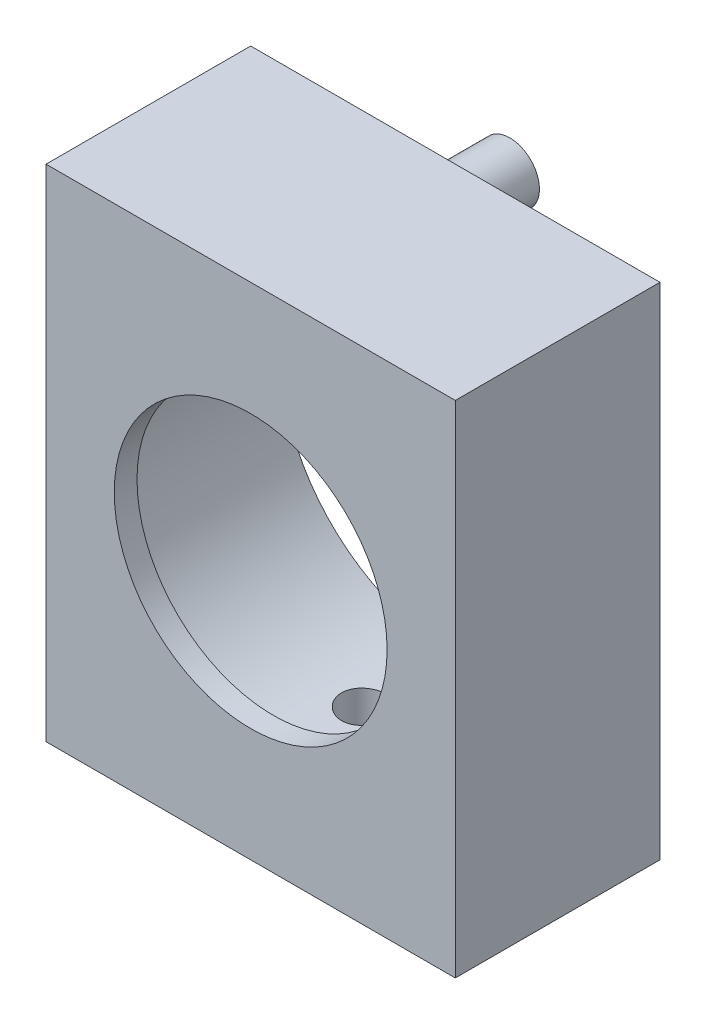
ISO-10303-21;
HEADER;
FILE_DESCRIPTION(('STEP AP214'),'2;1');
FILE_NAME('part.step','',(''),(''),'','','');
FILE_SCHEMA(('AUTOMOTIVE_DESIGN { 1 0 10303 214 1 1 1 1 }'));
ENDSEC;
DATA;
#1=APPLICATION_CONTEXT('core data for automotive mechanical design processes');
#2=APPLICATION_PROTOCOL_DEFINITION('international standard','automotive_design',2000,#1);
#3=PRODUCT_CONTEXT('',#1,'mechanical');
#4=PRODUCT('Part','Part','',(#3));
#5=PRODUCT_RELATED_PRODUCT_CATEGORY('part','',(#4));
#6=PRODUCT_DEFINITION_FORMATION('','',#4);
#7=PRODUCT_DEFINITION_CONTEXT('part definition',#1,'design');
#8=PRODUCT_DEFINITION('design','',#6,#7);
#9=PRODUCT_DEFINITION_SHAPE('','',#8);
#10=(LENGTH_UNIT() NAMED_UNIT(*) SI_UNIT(.MILLI.,.METRE.));
#11=(NAMED_UNIT(*) PLANE_ANGLE_UNIT() SI_UNIT($,.RADIAN.));
#12=(NAMED_UNIT(*) SI_UNIT($,.STERADIAN.) SOLID_ANGLE_UNIT());
#13=UNCERTAINTY_MEASURE_WITH_UNIT(LENGTH_MEASURE(1.E-05),#10,'distance_accuracy_value','');
#14=(GEOMETRIC_REPRESENTATION_CONTEXT(3) GLOBAL_UNCERTAINTY_ASSIGNED_CONTEXT((#13)) GLOBAL_UNIT_ASSIGNED_CONTEXT((#10,
#11,#12)) REPRESENTATION_CONTEXT('',''));
#15=CARTESIAN_POINT('',(0.,0.,0.));
#16=DIRECTION('',(0.,0.,1.));
#17=DIRECTION('',(1.,0.,0.));
#18=AXIS2_PLACEMENT_3D('',#15,#16,#17);
#19=CARTESIAN_POINT('',(0.,0.,-11.5965512114594));
#20=DIRECTION('',(0.,0.,1.));
#21=DIRECTION('',(1.,0.,0.));
#22=AXIS2_PLACEMENT_3D('',#19,#20,#21);
#23=CYLINDRICAL_SURFACE('',#22,3.85);
#24=CARTESIAN_POINT('',(0.,0.,4.));
#25=DIRECTION('',(0.,0.,-1.));
#26=DIRECTION('',(-1.,0.,0.));
#27=AXIS2_PLACEMENT_3D('',#24,#25,#26);
#28=CIRCLE('',#27,3.85);
#29=CARTESIAN_POINT('',(-3.85,0.,4.));
#30=VERTEX_POINT('',#29);
#31=EDGE_CURVE('E113',#30,#30,#28,.T.);
#32=ORIENTED_EDGE('',*,*,#31,.F.);
#33=EDGE_LOOP('',(#32));
#34=FACE_BOUND('',#33,.T.);
#35=CARTESIAN_POINT('',(0.,0.,0.));
#36=DIRECTION('',(0.,0.,1.));
#37=DIRECTION('',(1.,0.,0.));
#38=AXIS2_PLACEMENT_3D('',#35,#36,#37);
#39=CIRCLE('',#38,3.85);
#40=CARTESIAN_POINT('',(3.85,0.,0.));
#41=VERTEX_POINT('',#40);
#42=EDGE_CURVE('E117',#41,#41,#39,.T.);
#43=ORIENTED_EDGE('',*,*,#42,.F.);
#44=EDGE_LOOP('',(#43));
#45=FACE_BOUND('',#44,.T.);
#46=CARTESIAN_POINT('',(0.,-3.85,1.5));
#47=CARTESIAN_POINT('',(-0.0279589847294575,-3.84999959769869,1.50000118207081));
#48=CARTESIAN_POINT('',(-0.0559352157198916,-3.84969222760712,1.50235302337798));
#49=CARTESIAN_POINT('',(-0.11110856281064,-3.84849563580444,1.51169749591396));
#50=CARTESIAN_POINT('',(-0.138304845092465,-3.84760581396609,1.51869491380338));
#51=CARTESIAN_POINT('',(-0.191111610133948,-3.84534451728693,1.53712035863488));
#52=CARTESIAN_POINT('',(-0.216723170162717,-3.84397337396773,1.54854533655152));
#53=CARTESIAN_POINT('',(-0.265660771995411,-3.84090175397551,1.57549477149454));
#54=CARTESIAN_POINT('',(-0.288987191376989,-3.83920133184848,1.59101854969753));
#55=CARTESIAN_POINT('',(-0.332835233198467,-3.8356496044413,1.62582316898925));
#56=CARTESIAN_POINT('',(-0.353341365001042,-3.8337975485526,1.64512345110171));
#57=CARTESIAN_POINT('',(-0.390833282037115,-3.83015731140893,1.68689144823324));
#58=CARTESIAN_POINT('',(-0.407818883888929,-3.82836913348533,1.70935932814767));
#59=CARTESIAN_POINT('',(-0.437845781558562,-3.82505175412518,1.75692606308863));
#60=CARTESIAN_POINT('',(-0.450872473747333,-3.82352352048007,1.78203421009431));
#61=CARTESIAN_POINT('',(-0.47251849929155,-3.82090903608653,1.83410499363043));
#62=CARTESIAN_POINT('',(-0.481138012819861,-3.81982276727021,1.8610675542982));
#63=CARTESIAN_POINT('',(-0.493677732677922,-3.81822241843695,1.91592059020615));
#64=CARTESIAN_POINT('',(-0.497624168473593,-3.81770514588289,1.94380497445859));
#65=CARTESIAN_POINT('',(-0.50078688808746,-3.81729160355306,1.99984467379249));
#66=CARTESIAN_POINT('',(-0.500003376744084,-3.81739530688487,2.02799997708862));
#67=CARTESIAN_POINT('',(-0.493749956660182,-3.81820907760622,2.08359904401503));
#68=CARTESIAN_POINT('',(-0.488308998179935,-3.81891539908799,2.11104612641924));
#69=CARTESIAN_POINT('',(-0.472940329100254,-3.82084897764591,2.1646343603869));
#70=CARTESIAN_POINT('',(-0.463012521012043,-3.82207624604098,2.1907754835612));
#71=CARTESIAN_POINT('',(-0.438921032799276,-3.82491766407693,2.24109934966395));
#72=CARTESIAN_POINT('',(-0.424744829878784,-3.82653295464023,2.26527603051913));
#73=CARTESIAN_POINT('',(-0.39256791332235,-3.8299675436504,2.31091827681917));
#74=CARTESIAN_POINT('',(-0.374567010941831,-3.83178685216324,2.33238370838356));
#75=CARTESIAN_POINT('',(-0.335091508205917,-3.83544112110756,2.37216212331672));
#76=CARTESIAN_POINT('',(-0.313591965417391,-3.83727609694566,2.39045036186725));
#77=CARTESIAN_POINT('',(-0.267815196672377,-3.84074224844726,2.42316239114908));
#78=CARTESIAN_POINT('',(-0.243537963413449,-3.84237342357495,2.43758617172052));
#79=CARTESIAN_POINT('',(-0.192875444962997,-3.84524931277867,2.46216009087863));
#80=CARTESIAN_POINT('',(-0.166489367920358,-3.84649388082203,2.47230861509172));
#81=CARTESIAN_POINT('',(-0.112367838559315,-3.84845502469814,2.48802396188552));
#82=CARTESIAN_POINT('',(-0.0846324545398344,-3.84917162722575,2.49359101611503));
#83=CARTESIAN_POINT('',(-0.0288135012227168,-3.84999261686868,2.49995317310772));
#84=CARTESIAN_POINT('',(-0.000733877499501123,-3.85010137546104,2.50078235058514));
#85=CARTESIAN_POINT('',(0.0551639417255479,-3.84970624344155,2.49773523469302));
#86=CARTESIAN_POINT('',(0.0829821432329106,-3.84920236693831,2.49385904968517));
#87=CARTESIAN_POINT('',(0.137466434612487,-3.84764129981443,2.48153955293254));
#88=CARTESIAN_POINT('',(0.164136274133417,-3.84658608577962,2.47311255259793));
#89=CARTESIAN_POINT('',(0.215684264850843,-3.84404043995736,2.45194763904967));
#90=CARTESIAN_POINT('',(0.240562350805956,-3.84254999233216,2.43920956895736));
#91=CARTESIAN_POINT('',(0.287972394429826,-3.83928904848355,2.40970211489268));
#92=CARTESIAN_POINT('',(0.310490576050544,-3.83751704503262,2.39291076621345));
#93=CARTESIAN_POINT('',(0.352401288785364,-3.83389575679135,2.35580438358641));
#94=CARTESIAN_POINT('',(0.371793685504466,-3.8320464686824,2.33548919820705));
#95=CARTESIAN_POINT('',(0.407023808594848,-3.82846548116072,2.29176142145832));
#96=CARTESIAN_POINT('',(0.422838900311825,-3.82673457634178,2.26833051941729));
#97=CARTESIAN_POINT('',(0.45030893862457,-3.82359958970576,2.2191249671279));
#98=CARTESIAN_POINT('',(0.461963974140436,-3.82219550090331,2.19335036699024));
#99=CARTESIAN_POINT('',(0.480746692285119,-3.81987860215113,2.1402610924248));
#100=CARTESIAN_POINT('',(0.48788698205312,-3.81896442525319,2.11295094055578));
#101=CARTESIAN_POINT('',(0.497478042569008,-3.81772698987542,2.05750658570901));
#102=CARTESIAN_POINT('',(0.499929050272104,-3.8174037015373,2.02937242444241));
#103=CARTESIAN_POINT('',(0.50006739013214,-3.81738556341573,1.97330392879326));
#104=CARTESIAN_POINT('',(0.49779028603813,-3.81768602195129,1.94536967703682));
#105=CARTESIAN_POINT('',(0.488612514068286,-3.81887141692722,1.89028460217198));
#106=CARTESIAN_POINT('',(0.481711846953627,-3.81975635327137,1.8631337789346));
#107=CARTESIAN_POINT('',(0.4634942241946,-3.82200950833454,1.81039189871644));
#108=CARTESIAN_POINT('',(0.452179123502869,-3.8233775240399,1.78480019180757));
#109=CARTESIAN_POINT('',(0.42545732298021,-3.82644301430691,1.73587291784853));
#110=CARTESIAN_POINT('',(0.410050555844828,-3.82814049428785,1.71253738791917));
#111=CARTESIAN_POINT('',(0.375451286301707,-3.83168893327781,1.66860326094144));
#112=CARTESIAN_POINT('',(0.356232301473067,-3.83354091020063,1.6480256000588));
#113=CARTESIAN_POINT('',(0.314609630355847,-3.83718077045463,1.61037403417854));
#114=CARTESIAN_POINT('',(0.292205196477363,-3.83896863861649,1.59330095397258));
#115=CARTESIAN_POINT('',(0.244741630909286,-3.84228699509086,1.56308294857078));
#116=CARTESIAN_POINT('',(0.219671993119376,-3.84381639826172,1.54995441326998));
#117=CARTESIAN_POINT('',(0.167677543884764,-3.84643459519478,1.52811265049479));
#118=CARTESIAN_POINT('',(0.14075476704032,-3.84752386343697,1.51939466573088));
#119=CARTESIAN_POINT('',(0.0947465772180434,-3.84887897889866,1.50868873730701));
#120=CARTESIAN_POINT('',(0.0759502710318943,-3.84929729395406,1.50543519631835));
#121=CARTESIAN_POINT('',(0.0381053125479476,-3.84985794047702,1.50109043367787));
#122=CARTESIAN_POINT('',(0.0190566623191369,-3.85000027420596,1.49999919430822));
#123=CARTESIAN_POINT('',(0.,-3.85,1.5));
#124=B_SPLINE_CURVE_WITH_KNOTS('',3,(#46,#47,#48,#49,#50,#51,#52,#53,#54,#55,#56,#57,#58,#59,
#60,#61,#62,#63,#64,#65,#66,#67,#68,#69,#70,#71,#72,#73,#74,#75,#76,#77,#78,#79,#80,#81,#82,#83,
#84,#85,#86,#87,#88,#89,#90,#91,#92,#93,#94,#95,#96,#97,#98,#99,#100,#101,#102,#103,#104,#105,
#106,#107,#108,#109,#110,#111,#112,#113,#114,#115,#116,#117,#118,#119,#120,#121,#122,#123),
.UNSPECIFIED.,.T.,.F.,(4,2,2,2,2,2,2,2,2,2,2,2,2,2,2,2,2,2,2,2,2,2,2,2,2,2,2,2,2,2,2,2,2,2,2,2,
2,2,4),(0.,0.0838073414539818,0.167701169737428,0.251537327167042,0.335359608759247,
0.419625323753358,0.503895426980922,0.588472714671005,0.673046544422984,0.757143385923668,
0.841236585493341,0.924810834022776,1.00838689851303,1.09221178076047,1.17604080063184,
1.26049598079687,1.3449513829964,1.42943864775851,1.51392164040344,1.59779626079084,
1.68166894963271,1.76524299121233,1.84882007435542,1.93286065106011,2.01690484017663,
2.10146678644529,2.18602692511652,2.27034987986758,2.35466857356314,2.43835533992192,
2.52204209250339,2.60569371757618,2.68934671873271,2.77360258048111,2.85787824889522,
2.94249939495253,3.02702907166096,3.08415207909704,3.14127461846702),.UNSPECIFIED.);
#125=CARTESIAN_POINT('',(0.,-3.85,1.5));
#126=VERTEX_POINT('',#125);
#127=EDGE_CURVE('E101',#126,#126,#124,.T.);
#128=ORIENTED_EDGE('',*,*,#127,.F.);
#129=EDGE_LOOP('',(#128));
#130=FACE_BOUND('',#129,.T.);
#131=ADVANCED_FACE('F33',(#34,#45,#130),#23,.F.);
#132=CARTESIAN_POINT('',(0.,0.,4.));
#133=DIRECTION('',(0.,0.,1.));
#134=DIRECTION('',(1.,0.,0.));
#135=AXIS2_PLACEMENT_3D('',#132,#133,#134);
#136=PLANE('',#135);
#137=CARTESIAN_POINT('',(0.,0.,4.));
#138=DIRECTION('',(0.,0.,-1.));
#139=DIRECTION('',(-1.,0.,0.));
#140=AXIS2_PLACEMENT_3D('',#137,#138,#139);
#141=CIRCLE('',#140,3.);
#142=CARTESIAN_POINT('',(-3.,0.,4.));
#143=VERTEX_POINT('',#142);
#144=EDGE_CURVE('E120',#143,#143,#141,.T.);
#145=ORIENTED_EDGE('',*,*,#144,.F.);
#146=EDGE_LOOP('',(#145));
#147=FACE_BOUND('',#146,.T.);
#148=ORIENTED_EDGE('',*,*,#31,.T.);
#149=EDGE_LOOP('',(#148));
#150=FACE_BOUND('',#149,.T.);
#151=ADVANCED_FACE('F152',(#147,#150),#136,.F.);
#152=CARTESIAN_POINT('',(0.,0.,0.));
#153=DIRECTION('',(0.,0.,1.));
#154=DIRECTION('',(1.,0.,0.));
#155=AXIS2_PLACEMENT_3D('',#152,#153,#154);
#156=PLANE('',#155);
#157=DIRECTION('',(0.,1.,0.));
#158=VECTOR('',#157,1.);
#159=CARTESIAN_POINT('',(4.5,-4.13818346583101,0.));
#160=LINE('',#159,#158);
#161=CARTESIAN_POINT('',(4.5,-5.5,0.));
#162=VERTEX_POINT('',#161);
#163=CARTESIAN_POINT('',(4.5,5.5,0.));
#164=VERTEX_POINT('',#163);
#165=EDGE_CURVE('E72',#162,#164,#160,.T.);
#166=ORIENTED_EDGE('',*,*,#165,.F.);
#167=DIRECTION('',(-1.,0.,0.));
#168=VECTOR('',#167,1.);
#169=CARTESIAN_POINT('',(-4.5,-5.5,0.));
#170=LINE('',#169,#168);
#171=CARTESIAN_POINT('',(-4.5,-5.5,0.));
#172=VERTEX_POINT('',#171);
#173=EDGE_CURVE('E98',#162,#172,#170,.T.);
#174=ORIENTED_EDGE('',*,*,#173,.T.);
#175=DIRECTION('',(0.,-1.,0.));
#176=VECTOR('',#175,1.);
#177=CARTESIAN_POINT('',(-4.5,-4.29457666556557,0.));
#178=LINE('',#177,#176);
#179=CARTESIAN_POINT('',(-4.5,5.5,0.));
#180=VERTEX_POINT('',#179);
#181=EDGE_CURVE('E66',#180,#172,#178,.T.);
#182=ORIENTED_EDGE('',*,*,#181,.F.);
#183=DIRECTION('',(1.,0.,0.));
#184=VECTOR('',#183,1.);
#185=CARTESIAN_POINT('',(-4.5,5.5,0.));
#186=LINE('',#185,#184);
#187=EDGE_CURVE('E95',#180,#164,#186,.T.);
#188=ORIENTED_EDGE('',*,*,#187,.T.);
#189=EDGE_LOOP('',(#166,#174,#182,#188));
#190=FACE_BOUND('',#189,.T.);
#191=CARTESIAN_POINT('',(0.,-4.75,0.));
#192=DIRECTION('',(0.,0.,-1.));
#193=DIRECTION('',(-1.,0.,0.));
#194=AXIS2_PLACEMENT_3D('',#191,#192,#193);
#195=CIRCLE('',#194,0.65);
#196=CARTESIAN_POINT('',(-0.65,-4.75,0.));
#197=VERTEX_POINT('',#196);
#198=EDGE_CURVE('E133',#197,#197,#195,.T.);
#199=ORIENTED_EDGE('',*,*,#198,.F.);
#200=EDGE_LOOP('',(#199));
#201=FACE_BOUND('',#200,.T.);
#202=CARTESIAN_POINT('',(0.,4.75,0.));
#203=DIRECTION('',(0.,0.,-1.));
#204=DIRECTION('',(-1.,0.,0.));
#205=AXIS2_PLACEMENT_3D('',#202,#203,#204);
#206=CIRCLE('',#205,0.65);
#207=CARTESIAN_POINT('',(-0.65,4.75,0.));
#208=VERTEX_POINT('',#207);
#209=EDGE_CURVE('E128',#208,#208,#206,.T.);
#210=ORIENTED_EDGE('',*,*,#209,.F.);
#211=EDGE_LOOP('',(#210));
#212=FACE_BOUND('',#211,.T.);
#213=ORIENTED_EDGE('',*,*,#42,.T.);
#214=EDGE_LOOP('',(#213));
#215=FACE_BOUND('',#214,.T.);
#216=ADVANCED_FACE('F35',(#190,#201,#212,#215),#156,.F.);
#217=CARTESIAN_POINT('',(0.,0.,4.5));
#218=DIRECTION('',(0.,0.,1.));
#219=DIRECTION('',(1.,0.,0.));
#220=AXIS2_PLACEMENT_3D('',#217,#218,#219);
#221=PLANE('',#220);
#222=DIRECTION('',(0.,1.,0.));
#223=VECTOR('',#222,1.);
#224=CARTESIAN_POINT('',(-4.5,0.,4.5));
#225=LINE('',#224,#223);
#226=CARTESIAN_POINT('',(-4.5,-5.5,4.5));
#227=VERTEX_POINT('',#226);
#228=CARTESIAN_POINT('',(-4.5,5.5,4.5));
#229=VERTEX_POINT('',#228);
#230=EDGE_CURVE('E11',#227,#229,#225,.T.);
#231=ORIENTED_EDGE('',*,*,#230,.F.);
#232=DIRECTION('',(-1.,0.,0.));
#233=VECTOR('',#232,1.);
#234=CARTESIAN_POINT('',(-4.5,-5.5,4.5));
#235=LINE('',#234,#233);
#236=CARTESIAN_POINT('',(4.5,-5.5,4.5));
#237=VERTEX_POINT('',#236);
#238=EDGE_CURVE('E81',#237,#227,#235,.T.);
#239=ORIENTED_EDGE('',*,*,#238,.F.);
#240=DIRECTION('',(0.,-1.,0.));
#241=VECTOR('',#240,1.);
#242=CARTESIAN_POINT('',(4.5,0.,4.5));
#243=LINE('',#242,#241);
#244=CARTESIAN_POINT('',(4.5,5.5,4.5));
#245=VERTEX_POINT('',#244);
#246=EDGE_CURVE('E43',#245,#237,#243,.T.);
#247=ORIENTED_EDGE('',*,*,#246,.F.);
#248=DIRECTION('',(1.,0.,0.));
#249=VECTOR('',#248,1.);
#250=CARTESIAN_POINT('',(-4.5,5.5,4.5));
#251=LINE('',#250,#249);
#252=EDGE_CURVE('E83',#229,#245,#251,.T.);
#253=ORIENTED_EDGE('',*,*,#252,.F.);
#254=EDGE_LOOP('',(#231,#239,#247,#253));
#255=FACE_BOUND('',#254,.T.);
#256=CARTESIAN_POINT('',(0.,0.,4.5));
#257=DIRECTION('',(0.,0.,1.));
#258=DIRECTION('',(1.,0.,0.));
#259=AXIS2_PLACEMENT_3D('',#256,#257,#258);
#260=CIRCLE('',#259,3.);
#261=CARTESIAN_POINT('',(3.,0.,4.5));
#262=VERTEX_POINT('',#261);
#263=EDGE_CURVE('E123',#262,#262,#260,.T.);
#264=ORIENTED_EDGE('',*,*,#263,.F.);
#265=EDGE_LOOP('',(#264));
#266=FACE_BOUND('',#265,.T.);
#267=ADVANCED_FACE('F78',(#255,#266),#221,.T.);
#268=CARTESIAN_POINT('',(0.,-4.75,-1.2));
#269=DIRECTION('',(0.,0.,1.));
#270=DIRECTION('',(1.,0.,0.));
#271=AXIS2_PLACEMENT_3D('',#268,#269,#270);
#272=CYLINDRICAL_SURFACE('',#271,0.65);
#273=CARTESIAN_POINT('',(0.,-4.75,-1.2));
#274=DIRECTION('',(0.,0.,-1.));
#275=DIRECTION('',(-1.,0.,0.));
#276=AXIS2_PLACEMENT_3D('',#273,#274,#275);
#277=CIRCLE('',#276,0.65);
#278=CARTESIAN_POINT('',(-0.65,-4.75,-1.2));
#279=VERTEX_POINT('',#278);
#280=EDGE_CURVE('E127',#279,#279,#277,.T.);
#281=ORIENTED_EDGE('',*,*,#280,.F.);
#282=EDGE_LOOP('',(#281));
#283=FACE_BOUND('',#282,.T.);
#284=ORIENTED_EDGE('',*,*,#198,.T.);
#285=EDGE_LOOP('',(#284));
#286=FACE_BOUND('',#285,.T.);
#287=ADVANCED_FACE('F143',(#283,#286),#272,.T.);
#288=CARTESIAN_POINT('',(0.,-4.75,-1.2));
#289=DIRECTION('',(0.,0.,-1.));
#290=DIRECTION('',(-1.,0.,0.));
#291=AXIS2_PLACEMENT_3D('',#288,#289,#290);
#292=PLANE('',#291);
#293=ORIENTED_EDGE('',*,*,#280,.T.);
#294=EDGE_LOOP('',(#293));
#295=FACE_BOUND('',#294,.T.);
#296=ADVANCED_FACE('F149',(#295),#292,.T.);
#297=CARTESIAN_POINT('',(0.,4.75,-1.2));
#298=DIRECTION('',(0.,0.,1.));
#299=DIRECTION('',(1.,0.,0.));
#300=AXIS2_PLACEMENT_3D('',#297,#298,#299);
#301=CYLINDRICAL_SURFACE('',#300,0.65);
#302=CARTESIAN_POINT('',(0.,4.75,-1.2));
#303=DIRECTION('',(0.,0.,-1.));
#304=DIRECTION('',(-1.,0.,0.));
#305=AXIS2_PLACEMENT_3D('',#302,#303,#304);
#306=CIRCLE('',#305,0.65);
#307=CARTESIAN_POINT('',(-0.65,4.75,-1.2));
#308=VERTEX_POINT('',#307);
#309=EDGE_CURVE('E124',#308,#308,#306,.T.);
#310=ORIENTED_EDGE('',*,*,#309,.F.);
#311=EDGE_LOOP('',(#310));
#312=FACE_BOUND('',#311,.T.);
#313=ORIENTED_EDGE('',*,*,#209,.T.);
#314=EDGE_LOOP('',(#313));
#315=FACE_BOUND('',#314,.T.);
#316=ADVANCED_FACE('F171',(#312,#315),#301,.T.);
#317=CARTESIAN_POINT('',(0.,4.75,-1.2));
#318=DIRECTION('',(0.,0.,-1.));
#319=DIRECTION('',(-1.,0.,0.));
#320=AXIS2_PLACEMENT_3D('',#317,#318,#319);
#321=PLANE('',#320);
#322=ORIENTED_EDGE('',*,*,#309,.T.);
#323=EDGE_LOOP('',(#322));
#324=FACE_BOUND('',#323,.T.);
#325=ADVANCED_FACE('F168',(#324),#321,.T.);
#326=CARTESIAN_POINT('',(0.,0.,14.));
#327=DIRECTION('',(0.,0.,-1.));
#328=DIRECTION('',(-1.,0.,0.));
#329=AXIS2_PLACEMENT_3D('',#326,#327,#328);
#330=CYLINDRICAL_SURFACE('',#329,3.);
#331=ORIENTED_EDGE('',*,*,#263,.T.);
#332=EDGE_LOOP('',(#331));
#333=FACE_BOUND('',#332,.T.);
#334=ORIENTED_EDGE('',*,*,#144,.T.);
#335=EDGE_LOOP('',(#334));
#336=FACE_BOUND('',#335,.T.);
#337=ADVANCED_FACE('F140',(#333,#336),#330,.F.);
#338=CARTESIAN_POINT('',(4.5,-4.13818346583101,10.));
#339=DIRECTION('',(-1.,0.,0.));
#340=DIRECTION('',(0.,0.,1.));
#341=AXIS2_PLACEMENT_3D('',#338,#339,#340);
#342=PLANE('',#341);
#343=ORIENTED_EDGE('',*,*,#246,.T.);
#344=DIRECTION('',(0.,0.,-1.));
#345=VECTOR('',#344,1.);
#346=CARTESIAN_POINT('',(4.5,-5.5,4.5));
#347=LINE('',#346,#345);
#348=EDGE_CURVE('E92',#237,#162,#347,.T.);
#349=ORIENTED_EDGE('',*,*,#348,.T.);
#350=ORIENTED_EDGE('',*,*,#165,.T.);
#351=DIRECTION('',(0.,0.,-1.));
#352=VECTOR('',#351,1.);
#353=CARTESIAN_POINT('',(4.5,5.5,4.5));
#354=LINE('',#353,#352);
#355=EDGE_CURVE('E108',#245,#164,#354,.T.);
#356=ORIENTED_EDGE('',*,*,#355,.F.);
#357=EDGE_LOOP('',(#343,#349,#350,#356));
#358=FACE_BOUND('',#357,.T.);
#359=ADVANCED_FACE('F164',(#358),#342,.F.);
#360=CARTESIAN_POINT('',(-4.5,-4.29457666556557,10.));
#361=DIRECTION('',(1.,0.,0.));
#362=DIRECTION('',(0.,0.,-1.));
#363=AXIS2_PLACEMENT_3D('',#360,#361,#362);
#364=PLANE('',#363);
#365=ORIENTED_EDGE('',*,*,#230,.T.);
#366=DIRECTION('',(0.,0.,-1.));
#367=VECTOR('',#366,1.);
#368=CARTESIAN_POINT('',(-4.5,5.5,4.5));
#369=LINE('',#368,#367);
#370=EDGE_CURVE('E91',#229,#180,#369,.T.);
#371=ORIENTED_EDGE('',*,*,#370,.T.);
#372=ORIENTED_EDGE('',*,*,#181,.T.);
#373=DIRECTION('',(0.,0.,-1.));
#374=VECTOR('',#373,1.);
#375=CARTESIAN_POINT('',(-4.5,-5.5,4.5));
#376=LINE('',#375,#374);
#377=EDGE_CURVE('E87',#227,#172,#376,.T.);
#378=ORIENTED_EDGE('',*,*,#377,.F.);
#379=EDGE_LOOP('',(#365,#371,#372,#378));
#380=FACE_BOUND('',#379,.T.);
#381=ADVANCED_FACE('F88',(#380),#364,.F.);
#382=CARTESIAN_POINT('',(-4.5,5.5,4.5));
#383=DIRECTION('',(0.,1.,0.));
#384=DIRECTION('',(-1.,0.,0.));
#385=AXIS2_PLACEMENT_3D('',#382,#383,#384);
#386=PLANE('',#385);
#387=ORIENTED_EDGE('',*,*,#187,.F.);
#388=ORIENTED_EDGE('',*,*,#370,.F.);
#389=ORIENTED_EDGE('',*,*,#252,.T.);
#390=ORIENTED_EDGE('',*,*,#355,.T.);
#391=EDGE_LOOP('',(#387,#388,#389,#390));
#392=FACE_BOUND('',#391,.T.);
#393=ADVANCED_FACE('F201',(#392),#386,.T.);
#394=CARTESIAN_POINT('',(-4.5,-5.5,4.5));
#395=DIRECTION('',(0.,-1.,0.));
#396=DIRECTION('',(1.,0.,0.));
#397=AXIS2_PLACEMENT_3D('',#394,#395,#396);
#398=PLANE('',#397);
#399=CARTESIAN_POINT('',(0.,-5.5,2.));
#400=DIRECTION('',(0.,-1.,0.));
#401=DIRECTION('',(1.,0.,0.));
#402=AXIS2_PLACEMENT_3D('',#399,#400,#401);
#403=CIRCLE('',#402,0.5);
#404=CARTESIAN_POINT('',(0.5,-5.5,2.));
#405=VERTEX_POINT('',#404);
#406=EDGE_CURVE('E37',#405,#405,#403,.F.);
#407=ORIENTED_EDGE('',*,*,#406,.T.);
#408=EDGE_LOOP('',(#407));
#409=FACE_BOUND('',#408,.T.);
#410=ORIENTED_EDGE('',*,*,#173,.F.);
#411=ORIENTED_EDGE('',*,*,#348,.F.);
#412=ORIENTED_EDGE('',*,*,#238,.T.);
#413=ORIENTED_EDGE('',*,*,#377,.T.);
#414=EDGE_LOOP('',(#410,#411,#412,#413));
#415=FACE_BOUND('',#414,.T.);
#416=ADVANCED_FACE('F94',(#409,#415),#398,.T.);
#417=CARTESIAN_POINT('',(0.,5.501,2.));
#418=DIRECTION('',(0.,-1.,0.));
#419=DIRECTION('',(0.,0.,-1.));
#420=AXIS2_PLACEMENT_3D('',#417,#418,#419);
#421=CYLINDRICAL_SURFACE('',#420,0.5);
#422=ORIENTED_EDGE('',*,*,#406,.F.);
#423=EDGE_LOOP('',(#422));
#424=FACE_BOUND('',#423,.T.);
#425=ORIENTED_EDGE('',*,*,#127,.T.);
#426=EDGE_LOOP('',(#425));
#427=FACE_BOUND('',#426,.T.);
#428=ADVANCED_FACE('F196',(#424,#427),#421,.F.);
#429=CLOSED_SHELL('',(#131,#151,#216,#267,#287,#296,#316,#325,#337,#359,#381,#393,#416,#428));
#430=MANIFOLD_SOLID_BREP('B2',#429);
#431=ADVANCED_BREP_SHAPE_REPRESENTATION('',(#18,#430),#14);
#432=SHAPE_DEFINITION_REPRESENTATION(#9,#431);
ENDSEC;
END-ISO-10303-21;
